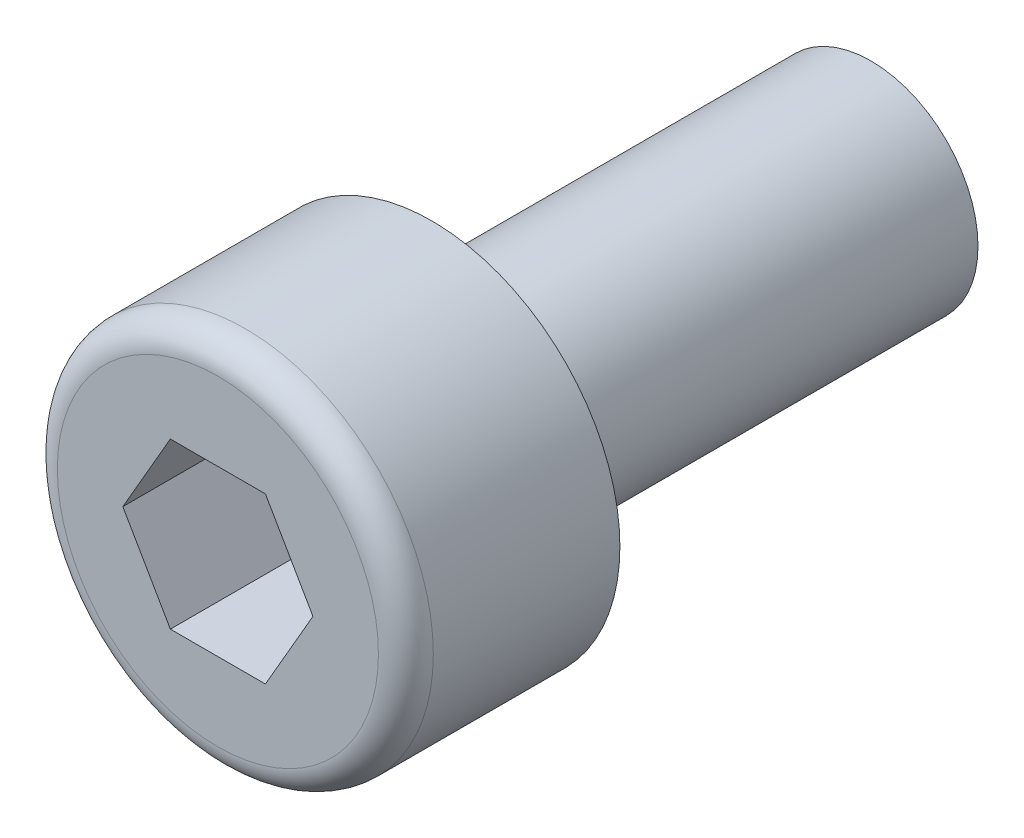
ISO-10303-21;
HEADER;
FILE_DESCRIPTION(('STEP AP214'),'2;1');
FILE_NAME('part.step','',(''),(''),'','','');
FILE_SCHEMA(('AUTOMOTIVE_DESIGN { 1 0 10303 214 1 1 1 1 }'));
ENDSEC;
DATA;
#1=APPLICATION_CONTEXT('core data for automotive mechanical design processes');
#2=APPLICATION_PROTOCOL_DEFINITION('international standard','automotive_design',2000,#1);
#3=PRODUCT_CONTEXT('',#1,'mechanical');
#4=PRODUCT('Part','Part','',(#3));
#5=PRODUCT_RELATED_PRODUCT_CATEGORY('part','',(#4));
#6=PRODUCT_DEFINITION_FORMATION('','',#4);
#7=PRODUCT_DEFINITION_CONTEXT('part definition',#1,'design');
#8=PRODUCT_DEFINITION('design','',#6,#7);
#9=PRODUCT_DEFINITION_SHAPE('','',#8);
#10=(LENGTH_UNIT() NAMED_UNIT(*) SI_UNIT(.MILLI.,.METRE.));
#11=(NAMED_UNIT(*) PLANE_ANGLE_UNIT() SI_UNIT($,.RADIAN.));
#12=(NAMED_UNIT(*) SI_UNIT($,.STERADIAN.) SOLID_ANGLE_UNIT());
#13=UNCERTAINTY_MEASURE_WITH_UNIT(LENGTH_MEASURE(1.E-05),#10,'distance_accuracy_value','');
#14=(GEOMETRIC_REPRESENTATION_CONTEXT(3) GLOBAL_UNCERTAINTY_ASSIGNED_CONTEXT((#13)) GLOBAL_UNIT_ASSIGNED_CONTEXT((#10,
#11,#12)) REPRESENTATION_CONTEXT('',''));
#15=CARTESIAN_POINT('',(0.,0.,0.));
#16=DIRECTION('',(0.,0.,1.));
#17=DIRECTION('',(1.,0.,0.));
#18=AXIS2_PLACEMENT_3D('',#15,#16,#17);
#19=CARTESIAN_POINT('',(0.,0.,3.9));
#20=DIRECTION('',(0.,0.,-1.));
#21=DIRECTION('',(-1.,0.,0.));
#22=AXIS2_PLACEMENT_3D('',#19,#20,#21);
#23=CYLINDRICAL_SURFACE('',#22,3.425);
#24=CARTESIAN_POINT('',(0.,0.,3.4));
#25=DIRECTION('',(0.,0.,1.));
#26=DIRECTION('',(1.,0.,0.));
#27=AXIS2_PLACEMENT_3D('',#24,#25,#26);
#28=CIRCLE('',#27,3.425);
#29=CARTESIAN_POINT('',(3.425,0.,3.4));
#30=VERTEX_POINT('',#29);
#31=EDGE_CURVE('E11',#30,#30,#28,.F.);
#32=ORIENTED_EDGE('',*,*,#31,.T.);
#33=EDGE_LOOP('',(#32));
#34=FACE_BOUND('',#33,.T.);
#35=CARTESIAN_POINT('',(0.,0.,0.));
#36=DIRECTION('',(0.,0.,1.));
#37=DIRECTION('',(1.,0.,0.));
#38=AXIS2_PLACEMENT_3D('',#35,#36,#37);
#39=CIRCLE('',#38,3.425);
#40=CARTESIAN_POINT('',(3.425,0.,0.));
#41=VERTEX_POINT('',#40);
#42=EDGE_CURVE('E167',#41,#41,#39,.T.);
#43=ORIENTED_EDGE('',*,*,#42,.T.);
#44=EDGE_LOOP('',(#43));
#45=FACE_BOUND('',#44,.T.);
#46=ADVANCED_FACE('F39',(#34,#45),#23,.T.);
#47=CARTESIAN_POINT('',(0.,0.,3.9));
#48=DIRECTION('',(0.,0.,1.));
#49=DIRECTION('',(1.,0.,0.));
#50=AXIS2_PLACEMENT_3D('',#47,#48,#49);
#51=PLANE('',#50);
#52=CARTESIAN_POINT('',(0.,0.,3.9));
#53=DIRECTION('',(0.,0.,1.));
#54=DIRECTION('',(1.,0.,0.));
#55=AXIS2_PLACEMENT_3D('',#52,#53,#54);
#56=CIRCLE('',#55,2.925);
#57=CARTESIAN_POINT('',(2.925,0.,3.9));
#58=VERTEX_POINT('',#57);
#59=EDGE_CURVE('E48',#58,#58,#56,.T.);
#60=ORIENTED_EDGE('',*,*,#59,.T.);
#61=EDGE_LOOP('',(#60));
#62=FACE_BOUND('',#61,.T.);
#63=DIRECTION('',(0.5,0.866025403784439,0.));
#64=VECTOR('',#63,1.);
#65=CARTESIAN_POINT('',(0.866025403784439,-1.5,3.9));
#66=LINE('',#65,#64);
#67=CARTESIAN_POINT('',(0.866025403784439,-1.5,3.9));
#68=VERTEX_POINT('',#67);
#69=CARTESIAN_POINT('',(1.73205080756888,0.,3.9));
#70=VERTEX_POINT('',#69);
#71=EDGE_CURVE('E55',#68,#70,#66,.T.);
#72=ORIENTED_EDGE('',*,*,#71,.F.);
#73=DIRECTION('',(1.,0.,0.));
#74=VECTOR('',#73,1.);
#75=CARTESIAN_POINT('',(-0.866025403784438,-1.5,3.9));
#76=LINE('',#75,#74);
#77=CARTESIAN_POINT('',(-0.866025403784438,-1.5,3.9));
#78=VERTEX_POINT('',#77);
#79=EDGE_CURVE('E148',#78,#68,#76,.T.);
#80=ORIENTED_EDGE('',*,*,#79,.F.);
#81=DIRECTION('',(0.5,-0.866025403784438,0.));
#82=VECTOR('',#81,1.);
#83=CARTESIAN_POINT('',(-1.73205080756888,0.,3.9));
#84=LINE('',#83,#82);
#85=CARTESIAN_POINT('',(-1.73205080756888,0.,3.9));
#86=VERTEX_POINT('',#85);
#87=EDGE_CURVE('E145',#86,#78,#84,.T.);
#88=ORIENTED_EDGE('',*,*,#87,.F.);
#89=DIRECTION('',(-0.5,-0.866025403784438,0.));
#90=VECTOR('',#89,1.);
#91=CARTESIAN_POINT('',(-0.866025403784439,1.5,3.9));
#92=LINE('',#91,#90);
#93=CARTESIAN_POINT('',(-0.866025403784439,1.5,3.9));
#94=VERTEX_POINT('',#93);
#95=EDGE_CURVE('E103',#94,#86,#92,.T.);
#96=ORIENTED_EDGE('',*,*,#95,.F.);
#97=DIRECTION('',(-1.,0.,0.));
#98=VECTOR('',#97,1.);
#99=CARTESIAN_POINT('',(0.866025403784437,1.5,3.9));
#100=LINE('',#99,#98);
#101=CARTESIAN_POINT('',(0.866025403784437,1.5,3.9));
#102=VERTEX_POINT('',#101);
#103=EDGE_CURVE('E139',#102,#94,#100,.T.);
#104=ORIENTED_EDGE('',*,*,#103,.F.);
#105=DIRECTION('',(-0.5,0.866025403784438,0.));
#106=VECTOR('',#105,1.);
#107=CARTESIAN_POINT('',(1.73205080756888,0.,3.9));
#108=LINE('',#107,#106);
#109=EDGE_CURVE('E135',#70,#102,#108,.T.);
#110=ORIENTED_EDGE('',*,*,#109,.F.);
#111=EDGE_LOOP('',(#72,#80,#88,#96,#104,#110));
#112=FACE_BOUND('',#111,.T.);
#113=ADVANCED_FACE('F178',(#62,#112),#51,.T.);
#114=CARTESIAN_POINT('',(0.,0.,0.));
#115=DIRECTION('',(0.,0.,1.));
#116=DIRECTION('',(1.,0.,0.));
#117=AXIS2_PLACEMENT_3D('',#114,#115,#116);
#118=PLANE('',#117);
#119=CARTESIAN_POINT('',(0.,0.,0.));
#120=DIRECTION('',(0.,0.,-1.));
#121=DIRECTION('',(-1.,0.,0.));
#122=AXIS2_PLACEMENT_3D('',#119,#120,#121);
#123=CIRCLE('',#122,1.95);
#124=CARTESIAN_POINT('',(-1.95,0.,0.));
#125=VERTEX_POINT('',#124);
#126=EDGE_CURVE('E168',#125,#125,#123,.T.);
#127=ORIENTED_EDGE('',*,*,#126,.F.);
#128=EDGE_LOOP('',(#127));
#129=FACE_BOUND('',#128,.T.);
#130=ORIENTED_EDGE('',*,*,#42,.F.);
#131=EDGE_LOOP('',(#130));
#132=FACE_BOUND('',#131,.T.);
#133=ADVANCED_FACE('F194',(#129,#132),#118,.F.);
#134=CARTESIAN_POINT('',(0.,0.,-8.));
#135=DIRECTION('',(0.,0.,1.));
#136=DIRECTION('',(1.,0.,0.));
#137=AXIS2_PLACEMENT_3D('',#134,#135,#136);
#138=CYLINDRICAL_SURFACE('',#137,1.95);
#139=CARTESIAN_POINT('',(0.,0.,-8.));
#140=DIRECTION('',(0.,0.,-1.));
#141=DIRECTION('',(-1.,0.,0.));
#142=AXIS2_PLACEMENT_3D('',#139,#140,#141);
#143=CIRCLE('',#142,1.95);
#144=CARTESIAN_POINT('',(-1.95,0.,-8.));
#145=VERTEX_POINT('',#144);
#146=EDGE_CURVE('E154',#145,#145,#143,.T.);
#147=ORIENTED_EDGE('',*,*,#146,.F.);
#148=EDGE_LOOP('',(#147));
#149=FACE_BOUND('',#148,.T.);
#150=ORIENTED_EDGE('',*,*,#126,.T.);
#151=EDGE_LOOP('',(#150));
#152=FACE_BOUND('',#151,.T.);
#153=ADVANCED_FACE('F199',(#149,#152),#138,.T.);
#154=CARTESIAN_POINT('',(0.,0.,-8.));
#155=DIRECTION('',(0.,0.,-1.));
#156=DIRECTION('',(-1.,0.,0.));
#157=AXIS2_PLACEMENT_3D('',#154,#155,#156);
#158=PLANE('',#157);
#159=ORIENTED_EDGE('',*,*,#146,.T.);
#160=EDGE_LOOP('',(#159));
#161=FACE_BOUND('',#160,.T.);
#162=ADVANCED_FACE('F204',(#161),#158,.T.);
#163=CARTESIAN_POINT('',(0.866025403784439,-1.5,1.4));
#164=DIRECTION('',(0.866025403784439,-0.5,0.));
#165=DIRECTION('',(0.5,0.866025403784439,0.));
#166=AXIS2_PLACEMENT_3D('',#163,#164,#165);
#167=PLANE('',#166);
#168=ORIENTED_EDGE('',*,*,#71,.T.);
#169=DIRECTION('',(0.,0.,1.));
#170=VECTOR('',#169,1.);
#171=CARTESIAN_POINT('',(1.73205080756888,0.,1.4));
#172=LINE('',#171,#170);
#173=CARTESIAN_POINT('',(1.73205080756888,0.,1.4));
#174=VERTEX_POINT('',#173);
#175=EDGE_CURVE('E85',#174,#70,#172,.T.);
#176=ORIENTED_EDGE('',*,*,#175,.F.);
#177=DIRECTION('',(0.5,0.866025403784439,0.));
#178=VECTOR('',#177,1.);
#179=CARTESIAN_POINT('',(0.866025403784439,-1.5,1.4));
#180=LINE('',#179,#178);
#181=CARTESIAN_POINT('',(0.866025403784439,-1.5,1.4));
#182=VERTEX_POINT('',#181);
#183=EDGE_CURVE('E151',#182,#174,#180,.T.);
#184=ORIENTED_EDGE('',*,*,#183,.F.);
#185=DIRECTION('',(0.,0.,1.));
#186=VECTOR('',#185,1.);
#187=CARTESIAN_POINT('',(0.866025403784439,-1.5,1.4));
#188=LINE('',#187,#186);
#189=EDGE_CURVE('E63',#182,#68,#188,.T.);
#190=ORIENTED_EDGE('',*,*,#189,.T.);
#191=EDGE_LOOP('',(#168,#176,#184,#190));
#192=FACE_BOUND('',#191,.T.);
#193=ADVANCED_FACE('F208',(#192),#167,.F.);
#194=CARTESIAN_POINT('',(-0.866025403784438,-1.5,1.4));
#195=DIRECTION('',(0.,-1.,0.));
#196=DIRECTION('',(1.,0.,0.));
#197=AXIS2_PLACEMENT_3D('',#194,#195,#196);
#198=PLANE('',#197);
#199=ORIENTED_EDGE('',*,*,#79,.T.);
#200=ORIENTED_EDGE('',*,*,#189,.F.);
#201=DIRECTION('',(1.,0.,0.));
#202=VECTOR('',#201,1.);
#203=CARTESIAN_POINT('',(-0.866025403784438,-1.5,1.4));
#204=LINE('',#203,#202);
#205=CARTESIAN_POINT('',(-0.866025403784438,-1.5,1.4));
#206=VERTEX_POINT('',#205);
#207=EDGE_CURVE('E117',#206,#182,#204,.T.);
#208=ORIENTED_EDGE('',*,*,#207,.F.);
#209=DIRECTION('',(0.,0.,1.));
#210=VECTOR('',#209,1.);
#211=CARTESIAN_POINT('',(-0.866025403784438,-1.5,1.4));
#212=LINE('',#211,#210);
#213=EDGE_CURVE('E108',#206,#78,#212,.T.);
#214=ORIENTED_EDGE('',*,*,#213,.T.);
#215=EDGE_LOOP('',(#199,#200,#208,#214));
#216=FACE_BOUND('',#215,.T.);
#217=ADVANCED_FACE('F212',(#216),#198,.F.);
#218=CARTESIAN_POINT('',(-1.73205080756888,0.,1.4));
#219=DIRECTION('',(-0.866025403784438,-0.5,0.));
#220=DIRECTION('',(0.5,-0.866025403784439,0.));
#221=AXIS2_PLACEMENT_3D('',#218,#219,#220);
#222=PLANE('',#221);
#223=ORIENTED_EDGE('',*,*,#87,.T.);
#224=ORIENTED_EDGE('',*,*,#213,.F.);
#225=DIRECTION('',(0.5,-0.866025403784438,0.));
#226=VECTOR('',#225,1.);
#227=CARTESIAN_POINT('',(-1.73205080756888,0.,1.4));
#228=LINE('',#227,#226);
#229=CARTESIAN_POINT('',(-1.73205080756888,0.,1.4));
#230=VERTEX_POINT('',#229);
#231=EDGE_CURVE('E112',#230,#206,#228,.T.);
#232=ORIENTED_EDGE('',*,*,#231,.F.);
#233=DIRECTION('',(0.,0.,1.));
#234=VECTOR('',#233,1.);
#235=CARTESIAN_POINT('',(-1.73205080756888,0.,1.4));
#236=LINE('',#235,#234);
#237=EDGE_CURVE('E96',#230,#86,#236,.T.);
#238=ORIENTED_EDGE('',*,*,#237,.T.);
#239=EDGE_LOOP('',(#223,#224,#232,#238));
#240=FACE_BOUND('',#239,.T.);
#241=ADVANCED_FACE('F113',(#240),#222,.F.);
#242=CARTESIAN_POINT('',(-0.866025403784439,1.5,1.4));
#243=DIRECTION('',(-0.866025403784439,0.5,0.));
#244=DIRECTION('',(-0.5,-0.866025403784439,0.));
#245=AXIS2_PLACEMENT_3D('',#242,#243,#244);
#246=PLANE('',#245);
#247=ORIENTED_EDGE('',*,*,#95,.T.);
#248=ORIENTED_EDGE('',*,*,#237,.F.);
#249=DIRECTION('',(-0.5,-0.866025403784438,0.));
#250=VECTOR('',#249,1.);
#251=CARTESIAN_POINT('',(-0.866025403784439,1.5,1.4));
#252=LINE('',#251,#250);
#253=CARTESIAN_POINT('',(-0.866025403784439,1.5,1.4));
#254=VERTEX_POINT('',#253);
#255=EDGE_CURVE('E100',#254,#230,#252,.T.);
#256=ORIENTED_EDGE('',*,*,#255,.F.);
#257=DIRECTION('',(0.,0.,1.));
#258=VECTOR('',#257,1.);
#259=CARTESIAN_POINT('',(-0.866025403784439,1.5,1.4));
#260=LINE('',#259,#258);
#261=EDGE_CURVE('E109',#254,#94,#260,.T.);
#262=ORIENTED_EDGE('',*,*,#261,.T.);
#263=EDGE_LOOP('',(#247,#248,#256,#262));
#264=FACE_BOUND('',#263,.T.);
#265=ADVANCED_FACE('F98',(#264),#246,.F.);
#266=CARTESIAN_POINT('',(0.866025403784437,1.5,1.4));
#267=DIRECTION('',(0.,1.,0.));
#268=DIRECTION('',(-1.,0.,0.));
#269=AXIS2_PLACEMENT_3D('',#266,#267,#268);
#270=PLANE('',#269);
#271=ORIENTED_EDGE('',*,*,#103,.T.);
#272=ORIENTED_EDGE('',*,*,#261,.F.);
#273=DIRECTION('',(-1.,0.,0.));
#274=VECTOR('',#273,1.);
#275=CARTESIAN_POINT('',(0.866025403784437,1.5,1.4));
#276=LINE('',#275,#274);
#277=CARTESIAN_POINT('',(0.866025403784437,1.5,1.4));
#278=VERTEX_POINT('',#277);
#279=EDGE_CURVE('E123',#278,#254,#276,.T.);
#280=ORIENTED_EDGE('',*,*,#279,.F.);
#281=DIRECTION('',(0.,0.,1.));
#282=VECTOR('',#281,1.);
#283=CARTESIAN_POINT('',(0.866025403784437,1.5,1.4));
#284=LINE('',#283,#282);
#285=EDGE_CURVE('E159',#278,#102,#284,.T.);
#286=ORIENTED_EDGE('',*,*,#285,.T.);
#287=EDGE_LOOP('',(#271,#272,#280,#286));
#288=FACE_BOUND('',#287,.T.);
#289=ADVANCED_FACE('F215',(#288),#270,.F.);
#290=CARTESIAN_POINT('',(1.73205080756888,0.,1.4));
#291=DIRECTION('',(0.866025403784438,0.5,0.));
#292=DIRECTION('',(-0.5,0.866025403784439,0.));
#293=AXIS2_PLACEMENT_3D('',#290,#291,#292);
#294=PLANE('',#293);
#295=ORIENTED_EDGE('',*,*,#109,.T.);
#296=ORIENTED_EDGE('',*,*,#285,.F.);
#297=DIRECTION('',(-0.5,0.866025403784438,0.));
#298=VECTOR('',#297,1.);
#299=CARTESIAN_POINT('',(1.73205080756888,0.,1.4));
#300=LINE('',#299,#298);
#301=EDGE_CURVE('E127',#174,#278,#300,.T.);
#302=ORIENTED_EDGE('',*,*,#301,.F.);
#303=ORIENTED_EDGE('',*,*,#175,.T.);
#304=EDGE_LOOP('',(#295,#296,#302,#303));
#305=FACE_BOUND('',#304,.T.);
#306=ADVANCED_FACE('F186',(#305),#294,.F.);
#307=CARTESIAN_POINT('',(0.,0.,1.4));
#308=DIRECTION('',(0.,0.,1.));
#309=DIRECTION('',(1.,0.,0.));
#310=AXIS2_PLACEMENT_3D('',#307,#308,#309);
#311=PLANE('',#310);
#312=ORIENTED_EDGE('',*,*,#183,.T.);
#313=ORIENTED_EDGE('',*,*,#301,.T.);
#314=ORIENTED_EDGE('',*,*,#279,.T.);
#315=ORIENTED_EDGE('',*,*,#255,.T.);
#316=ORIENTED_EDGE('',*,*,#231,.T.);
#317=ORIENTED_EDGE('',*,*,#207,.T.);
#318=EDGE_LOOP('',(#312,#313,#314,#315,#316,#317));
#319=FACE_BOUND('',#318,.T.);
#320=ADVANCED_FACE('F120',(#319),#311,.T.);
#321=CARTESIAN_POINT('',(0.,0.,3.4));
#322=DIRECTION('',(0.,0.,1.));
#323=DIRECTION('',(1.,0.,0.));
#324=AXIS2_PLACEMENT_3D('',#321,#322,#323);
#325=TOROIDAL_SURFACE('',#324,2.925,0.5);
#326=ORIENTED_EDGE('',*,*,#31,.F.);
#327=EDGE_LOOP('',(#326));
#328=FACE_BOUND('',#327,.T.);
#329=ORIENTED_EDGE('',*,*,#59,.F.);
#330=EDGE_LOOP('',(#329));
#331=FACE_BOUND('',#330,.T.);
#332=ADVANCED_FACE('F41',(#328,#331),#325,.T.);
#333=CLOSED_SHELL('',(#46,#113,#133,#153,#162,#193,#217,#241,#265,#289,#306,#320,#332));
#334=MANIFOLD_SOLID_BREP('B2',#333);
#335=ADVANCED_BREP_SHAPE_REPRESENTATION('',(#18,#334),#14);
#336=SHAPE_DEFINITION_REPRESENTATION(#9,#335);
ENDSEC;
END-ISO-10303-21;
